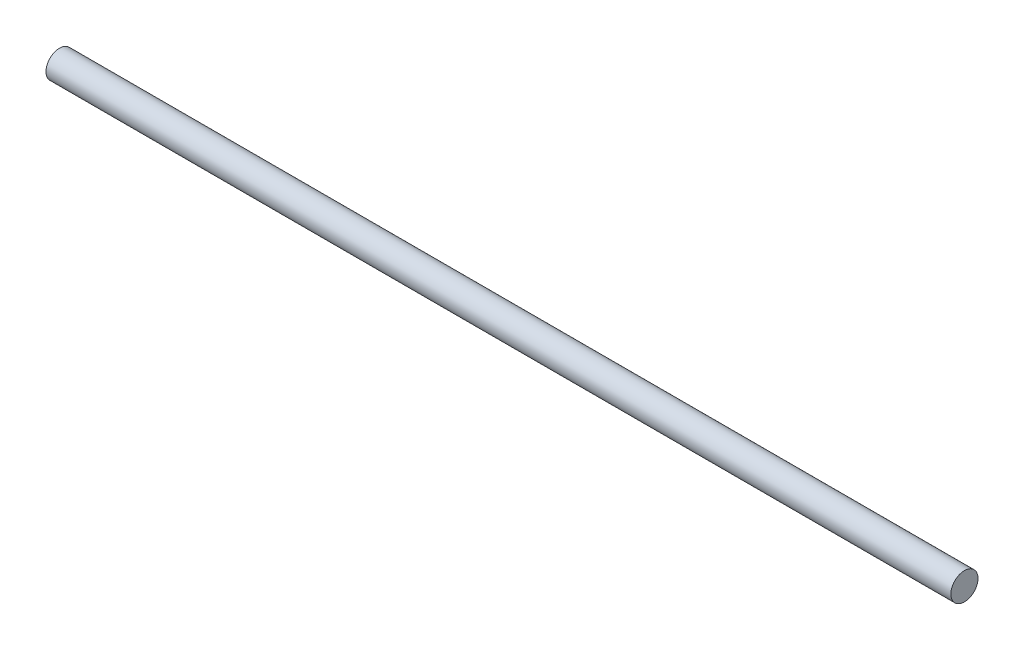
ISO-10303-21;
HEADER;
FILE_DESCRIPTION(('STEP AP214'),'2;1');
FILE_NAME('part.step','',(''),(''),'','','');
FILE_SCHEMA(('AUTOMOTIVE_DESIGN { 1 0 10303 214 1 1 1 1 }'));
ENDSEC;
DATA;
#1=APPLICATION_CONTEXT('core data for automotive mechanical design processes');
#2=APPLICATION_PROTOCOL_DEFINITION('international standard','automotive_design',2000,#1);
#3=PRODUCT_CONTEXT('',#1,'mechanical');
#4=PRODUCT('Part','Part','',(#3));
#5=PRODUCT_RELATED_PRODUCT_CATEGORY('part','',(#4));
#6=PRODUCT_DEFINITION_FORMATION('','',#4);
#7=PRODUCT_DEFINITION_CONTEXT('part definition',#1,'design');
#8=PRODUCT_DEFINITION('design','',#6,#7);
#9=PRODUCT_DEFINITION_SHAPE('','',#8);
#10=(LENGTH_UNIT() NAMED_UNIT(*) SI_UNIT(.MILLI.,.METRE.));
#11=(NAMED_UNIT(*) PLANE_ANGLE_UNIT() SI_UNIT($,.RADIAN.));
#12=(NAMED_UNIT(*) SI_UNIT($,.STERADIAN.) SOLID_ANGLE_UNIT());
#13=UNCERTAINTY_MEASURE_WITH_UNIT(LENGTH_MEASURE(1.E-05),#10,'distance_accuracy_value','');
#14=(GEOMETRIC_REPRESENTATION_CONTEXT(3) GLOBAL_UNCERTAINTY_ASSIGNED_CONTEXT((#13)) GLOBAL_UNIT_ASSIGNED_CONTEXT((#10,
#11,#12)) REPRESENTATION_CONTEXT('',''));
#15=CARTESIAN_POINT('',(0.,0.,0.));
#16=DIRECTION('',(0.,0.,1.));
#17=DIRECTION('',(1.,0.,0.));
#18=AXIS2_PLACEMENT_3D('',#15,#16,#17);
#19=CARTESIAN_POINT('',(250.,0.,0.));
#20=DIRECTION('',(-1.,0.,0.));
#21=DIRECTION('',(0.,0.,1.));
#22=AXIS2_PLACEMENT_3D('',#19,#20,#21);
#23=CYLINDRICAL_SURFACE('',#22,7.5);
#24=CARTESIAN_POINT('',(250.,0.,0.));
#25=DIRECTION('',(1.,0.,0.));
#26=DIRECTION('',(0.,0.,-1.));
#27=AXIS2_PLACEMENT_3D('',#24,#25,#26);
#28=CIRCLE('',#27,7.5);
#29=CARTESIAN_POINT('',(250.,0.,-7.5));
#30=VERTEX_POINT('',#29);
#31=EDGE_CURVE('E10',#30,#30,#28,.T.);
#32=ORIENTED_EDGE('',*,*,#31,.F.);
#33=EDGE_LOOP('',(#32));
#34=FACE_BOUND('',#33,.T.);
#35=CARTESIAN_POINT('',(-250.,0.,0.));
#36=DIRECTION('',(1.,0.,0.));
#37=DIRECTION('',(0.,0.,-1.));
#38=AXIS2_PLACEMENT_3D('',#35,#36,#37);
#39=CIRCLE('',#38,7.5);
#40=CARTESIAN_POINT('',(-250.,0.,-7.5));
#41=VERTEX_POINT('',#40);
#42=EDGE_CURVE('E34',#41,#41,#39,.T.);
#43=ORIENTED_EDGE('',*,*,#42,.T.);
#44=EDGE_LOOP('',(#43));
#45=FACE_BOUND('',#44,.T.);
#46=ADVANCED_FACE('F31',(#34,#45),#23,.T.);
#47=CARTESIAN_POINT('',(250.,0.,0.));
#48=DIRECTION('',(1.,0.,0.));
#49=DIRECTION('',(0.,0.,-1.));
#50=AXIS2_PLACEMENT_3D('',#47,#48,#49);
#51=PLANE('',#50);
#52=ORIENTED_EDGE('',*,*,#31,.T.);
#53=EDGE_LOOP('',(#52));
#54=FACE_BOUND('',#53,.T.);
#55=ADVANCED_FACE('F46',(#54),#51,.T.);
#56=CARTESIAN_POINT('',(-250.,0.,0.));
#57=DIRECTION('',(1.,0.,0.));
#58=DIRECTION('',(0.,0.,-1.));
#59=AXIS2_PLACEMENT_3D('',#56,#57,#58);
#60=PLANE('',#59);
#61=ORIENTED_EDGE('',*,*,#42,.F.);
#62=EDGE_LOOP('',(#61));
#63=FACE_BOUND('',#62,.T.);
#64=ADVANCED_FACE('F44',(#63),#60,.F.);
#65=CLOSED_SHELL('',(#46,#55,#64));
#66=MANIFOLD_SOLID_BREP('B2',#65);
#67=ADVANCED_BREP_SHAPE_REPRESENTATION('',(#18,#66),#14);
#68=SHAPE_DEFINITION_REPRESENTATION(#9,#67);
ENDSEC;
END-ISO-10303-21;
